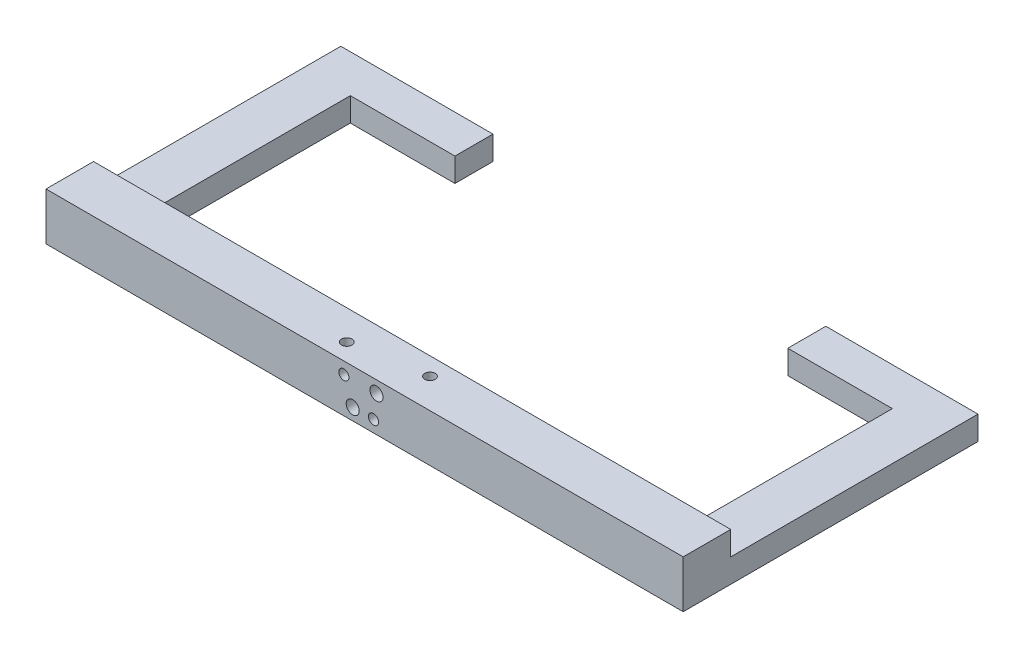
ISO-10303-21;
HEADER;
FILE_DESCRIPTION(('STEP AP214'),'2;1');
FILE_NAME('part.step','',(''),(''),'','','');
FILE_SCHEMA(('AUTOMOTIVE_DESIGN { 1 0 10303 214 1 1 1 1 }'));
ENDSEC;
DATA;
#1=APPLICATION_CONTEXT('core data for automotive mechanical design processes');
#2=APPLICATION_PROTOCOL_DEFINITION('international standard','automotive_design',2000,#1);
#3=PRODUCT_CONTEXT('',#1,'mechanical');
#4=PRODUCT('Part','Part','',(#3));
#5=PRODUCT_RELATED_PRODUCT_CATEGORY('part','',(#4));
#6=PRODUCT_DEFINITION_FORMATION('','',#4);
#7=PRODUCT_DEFINITION_CONTEXT('part definition',#1,'design');
#8=PRODUCT_DEFINITION('design','',#6,#7);
#9=PRODUCT_DEFINITION_SHAPE('','',#8);
#10=(LENGTH_UNIT() NAMED_UNIT(*) SI_UNIT(.MILLI.,.METRE.));
#11=(NAMED_UNIT(*) PLANE_ANGLE_UNIT() SI_UNIT($,.RADIAN.));
#12=(NAMED_UNIT(*) SI_UNIT($,.STERADIAN.) SOLID_ANGLE_UNIT());
#13=UNCERTAINTY_MEASURE_WITH_UNIT(LENGTH_MEASURE(1.E-05),#10,'distance_accuracy_value','');
#14=(GEOMETRIC_REPRESENTATION_CONTEXT(3) GLOBAL_UNCERTAINTY_ASSIGNED_CONTEXT((#13)) GLOBAL_UNIT_ASSIGNED_CONTEXT((#10,
#11,#12)) REPRESENTATION_CONTEXT('',''));
#15=CARTESIAN_POINT('',(0.,0.,0.));
#16=DIRECTION('',(0.,0.,1.));
#17=DIRECTION('',(1.,0.,0.));
#18=AXIS2_PLACEMENT_3D('',#15,#16,#17);
#19=CARTESIAN_POINT('',(0.,12.7,-12.7));
#20=DIRECTION('',(0.,0.,-1.));
#21=DIRECTION('',(-1.,0.,0.));
#22=AXIS2_PLACEMENT_3D('',#19,#20,#21);
#23=PLANE('',#22);
#24=CARTESIAN_POINT('',(88.265,9.525,-12.7));
#25=DIRECTION('',(0.,0.,-1.));
#26=DIRECTION('',(-1.,0.,0.));
#27=AXIS2_PLACEMENT_3D('',#24,#25,#26);
#28=CIRCLE('',#27,1.75);
#29=CARTESIAN_POINT('',(86.515,9.525,-12.7));
#30=VERTEX_POINT('',#29);
#31=EDGE_CURVE('E254',#30,#30,#28,.T.);
#32=ORIENTED_EDGE('',*,*,#31,.F.);
#33=EDGE_LOOP('',(#32));
#34=FACE_BOUND('',#33,.T.);
#35=CARTESIAN_POINT('',(81.915,3.175,-12.7));
#36=DIRECTION('',(0.,0.,-1.));
#37=DIRECTION('',(-1.,0.,0.));
#38=AXIS2_PLACEMENT_3D('',#35,#36,#37);
#39=CIRCLE('',#38,1.75);
#40=CARTESIAN_POINT('',(80.165,3.175,-12.7));
#41=VERTEX_POINT('',#40);
#42=EDGE_CURVE('E260',#41,#41,#39,.T.);
#43=ORIENTED_EDGE('',*,*,#42,.F.);
#44=EDGE_LOOP('',(#43));
#45=FACE_BOUND('',#44,.T.);
#46=CARTESIAN_POINT('',(87.4776,3.175,-12.7));
#47=DIRECTION('',(0.,0.,-1.));
#48=DIRECTION('',(-1.,0.,0.));
#49=AXIS2_PLACEMENT_3D('',#46,#47,#48);
#50=CIRCLE('',#49,1.35255);
#51=CARTESIAN_POINT('',(86.12505,3.175,-12.7));
#52=VERTEX_POINT('',#51);
#53=EDGE_CURVE('E267',#52,#52,#50,.T.);
#54=ORIENTED_EDGE('',*,*,#53,.F.);
#55=EDGE_LOOP('',(#54));
#56=FACE_BOUND('',#55,.T.);
#57=CARTESIAN_POINT('',(79.5464525420341,9.525,-12.7));
#58=DIRECTION('',(0.,0.,-1.));
#59=DIRECTION('',(-1.,0.,0.));
#60=AXIS2_PLACEMENT_3D('',#57,#58,#59);
#61=CIRCLE('',#60,1.35255);
#62=CARTESIAN_POINT('',(78.1939025420341,9.525,-12.7));
#63=VERTEX_POINT('',#62);
#64=EDGE_CURVE('E271',#63,#63,#61,.T.);
#65=ORIENTED_EDGE('',*,*,#64,.F.);
#66=EDGE_LOOP('',(#65));
#67=FACE_BOUND('',#66,.T.);
#68=DIRECTION('',(1.,0.,0.));
#69=VECTOR('',#68,1.);
#70=CARTESIAN_POINT('',(0.,6.35,-12.7));
#71=LINE('',#70,#69);
#72=CARTESIAN_POINT('',(157.48,6.35,-12.7));
#73=VERTEX_POINT('',#72);
#74=CARTESIAN_POINT('',(170.18,6.35,-12.7));
#75=VERTEX_POINT('',#74);
#76=EDGE_CURVE('E58',#73,#75,#71,.T.);
#77=ORIENTED_EDGE('',*,*,#76,.F.);
#78=DIRECTION('',(0.,-1.,0.));
#79=VECTOR('',#78,1.);
#80=CARTESIAN_POINT('',(157.48,6.35,-12.7));
#81=LINE('',#80,#79);
#82=CARTESIAN_POINT('',(157.48,0.,-12.7));
#83=VERTEX_POINT('',#82);
#84=EDGE_CURVE('E63',#73,#83,#81,.T.);
#85=ORIENTED_EDGE('',*,*,#84,.T.);
#86=DIRECTION('',(1.,0.,0.));
#87=VECTOR('',#86,1.);
#88=CARTESIAN_POINT('',(0.,0.,-12.7));
#89=LINE('',#88,#87);
#90=CARTESIAN_POINT('',(12.7,0.,-12.7));
#91=VERTEX_POINT('',#90);
#92=EDGE_CURVE('E190',#91,#83,#89,.T.);
#93=ORIENTED_EDGE('',*,*,#92,.F.);
#94=DIRECTION('',(0.,-1.,0.));
#95=VECTOR('',#94,1.);
#96=CARTESIAN_POINT('',(12.7,6.35,-12.7));
#97=LINE('',#96,#95);
#98=CARTESIAN_POINT('',(12.7,6.35,-12.7));
#99=VERTEX_POINT('',#98);
#100=EDGE_CURVE('E11',#99,#91,#97,.T.);
#101=ORIENTED_EDGE('',*,*,#100,.F.);
#102=DIRECTION('',(-1.,0.,0.));
#103=VECTOR('',#102,1.);
#104=CARTESIAN_POINT('',(0.,6.35,-12.7));
#105=LINE('',#104,#103);
#106=CARTESIAN_POINT('',(0.,6.35,-12.7));
#107=VERTEX_POINT('',#106);
#108=EDGE_CURVE('E217',#99,#107,#105,.T.);
#109=ORIENTED_EDGE('',*,*,#108,.T.);
#110=DIRECTION('',(0.,-1.,0.));
#111=VECTOR('',#110,1.);
#112=CARTESIAN_POINT('',(0.,12.7,-12.7));
#113=LINE('',#112,#111);
#114=CARTESIAN_POINT('',(0.,12.7,-12.7));
#115=VERTEX_POINT('',#114);
#116=EDGE_CURVE('E213',#115,#107,#113,.T.);
#117=ORIENTED_EDGE('',*,*,#116,.F.);
#118=DIRECTION('',(1.,0.,0.));
#119=VECTOR('',#118,1.);
#120=CARTESIAN_POINT('',(0.,12.7,-12.7));
#121=LINE('',#120,#119);
#122=CARTESIAN_POINT('',(170.18,12.7,-12.7));
#123=VERTEX_POINT('',#122);
#124=EDGE_CURVE('E191',#115,#123,#121,.T.);
#125=ORIENTED_EDGE('',*,*,#124,.T.);
#126=DIRECTION('',(0.,-1.,0.));
#127=VECTOR('',#126,1.);
#128=CARTESIAN_POINT('',(170.18,12.7,-12.7));
#129=LINE('',#128,#127);
#130=EDGE_CURVE('E201',#123,#75,#129,.T.);
#131=ORIENTED_EDGE('',*,*,#130,.T.);
#132=EDGE_LOOP('',(#77,#85,#93,#101,#109,#117,#125,#131));
#133=FACE_BOUND('',#132,.T.);
#134=ADVANCED_FACE('F41',(#34,#45,#56,#67,#133),#23,.T.);
#135=CARTESIAN_POINT('',(12.7,6.35,0.));
#136=DIRECTION('',(1.,0.,0.));
#137=DIRECTION('',(0.,0.,-1.));
#138=AXIS2_PLACEMENT_3D('',#135,#136,#137);
#139=PLANE('',#138);
#140=DIRECTION('',(0.,0.,1.));
#141=VECTOR('',#140,1.);
#142=CARTESIAN_POINT('',(12.7,0.,0.));
#143=LINE('',#142,#141);
#144=CARTESIAN_POINT('',(12.7,0.,-68.58));
#145=VERTEX_POINT('',#144);
#146=EDGE_CURVE('E216',#145,#91,#143,.T.);
#147=ORIENTED_EDGE('',*,*,#146,.F.);
#148=DIRECTION('',(0.,-1.,0.));
#149=VECTOR('',#148,1.);
#150=CARTESIAN_POINT('',(12.7,6.35,-68.58));
#151=LINE('',#150,#149);
#152=CARTESIAN_POINT('',(12.7,6.35,-68.58));
#153=VERTEX_POINT('',#152);
#154=EDGE_CURVE('E50',#153,#145,#151,.T.);
#155=ORIENTED_EDGE('',*,*,#154,.F.);
#156=DIRECTION('',(0.,0.,1.));
#157=VECTOR('',#156,1.);
#158=CARTESIAN_POINT('',(12.7,6.35,0.));
#159=LINE('',#158,#157);
#160=EDGE_CURVE('E220',#153,#99,#159,.T.);
#161=ORIENTED_EDGE('',*,*,#160,.T.);
#162=ORIENTED_EDGE('',*,*,#100,.T.);
#163=EDGE_LOOP('',(#147,#155,#161,#162));
#164=FACE_BOUND('',#163,.T.);
#165=ADVANCED_FACE('F43',(#164),#139,.T.);
#166=CARTESIAN_POINT('',(0.,6.35,-68.58));
#167=DIRECTION('',(0.,0.,1.));
#168=DIRECTION('',(1.,0.,0.));
#169=AXIS2_PLACEMENT_3D('',#166,#167,#168);
#170=PLANE('',#169);
#171=DIRECTION('',(-1.,0.,0.));
#172=VECTOR('',#171,1.);
#173=CARTESIAN_POINT('',(0.,0.,-68.58));
#174=LINE('',#173,#172);
#175=CARTESIAN_POINT('',(40.64,0.,-68.58));
#176=VERTEX_POINT('',#175);
#177=EDGE_CURVE('E237',#176,#145,#174,.T.);
#178=ORIENTED_EDGE('',*,*,#177,.F.);
#179=DIRECTION('',(0.,-1.,0.));
#180=VECTOR('',#179,1.);
#181=CARTESIAN_POINT('',(40.64,6.35,-68.58));
#182=LINE('',#181,#180);
#183=CARTESIAN_POINT('',(40.64,6.35,-68.58));
#184=VERTEX_POINT('',#183);
#185=EDGE_CURVE('E250',#184,#176,#182,.T.);
#186=ORIENTED_EDGE('',*,*,#185,.F.);
#187=DIRECTION('',(-1.,0.,0.));
#188=VECTOR('',#187,1.);
#189=CARTESIAN_POINT('',(0.,6.35,-68.58));
#190=LINE('',#189,#188);
#191=EDGE_CURVE('E224',#184,#153,#190,.T.);
#192=ORIENTED_EDGE('',*,*,#191,.T.);
#193=ORIENTED_EDGE('',*,*,#154,.T.);
#194=EDGE_LOOP('',(#178,#186,#192,#193));
#195=FACE_BOUND('',#194,.T.);
#196=ADVANCED_FACE('F307',(#195),#170,.T.);
#197=CARTESIAN_POINT('',(40.64,6.35,0.));
#198=DIRECTION('',(-1.,0.,0.));
#199=DIRECTION('',(0.,0.,1.));
#200=AXIS2_PLACEMENT_3D('',#197,#198,#199);
#201=PLANE('',#200);
#202=DIRECTION('',(0.,0.,-1.));
#203=VECTOR('',#202,1.);
#204=CARTESIAN_POINT('',(40.64,0.,0.));
#205=LINE('',#204,#203);
#206=CARTESIAN_POINT('',(40.64,0.,-78.74));
#207=VERTEX_POINT('',#206);
#208=EDGE_CURVE('E240',#176,#207,#205,.T.);
#209=ORIENTED_EDGE('',*,*,#208,.T.);
#210=DIRECTION('',(0.,-1.,0.));
#211=VECTOR('',#210,1.);
#212=CARTESIAN_POINT('',(40.64,6.35,-78.74));
#213=LINE('',#212,#211);
#214=CARTESIAN_POINT('',(40.64,6.35,-78.74));
#215=VERTEX_POINT('',#214);
#216=EDGE_CURVE('E248',#215,#207,#213,.T.);
#217=ORIENTED_EDGE('',*,*,#216,.F.);
#218=DIRECTION('',(0.,0.,-1.));
#219=VECTOR('',#218,1.);
#220=CARTESIAN_POINT('',(40.64,6.35,0.));
#221=LINE('',#220,#219);
#222=EDGE_CURVE('E227',#184,#215,#221,.T.);
#223=ORIENTED_EDGE('',*,*,#222,.F.);
#224=ORIENTED_EDGE('',*,*,#185,.T.);
#225=EDGE_LOOP('',(#209,#217,#223,#224));
#226=FACE_BOUND('',#225,.T.);
#227=ADVANCED_FACE('F312',(#226),#201,.F.);
#228=CARTESIAN_POINT('',(0.,6.35,-78.74));
#229=DIRECTION('',(0.,0.,-1.));
#230=DIRECTION('',(-1.,0.,0.));
#231=AXIS2_PLACEMENT_3D('',#228,#229,#230);
#232=PLANE('',#231);
#233=DIRECTION('',(1.,0.,0.));
#234=VECTOR('',#233,1.);
#235=CARTESIAN_POINT('',(0.,0.,-78.74));
#236=LINE('',#235,#234);
#237=CARTESIAN_POINT('',(0.,0.,-78.74));
#238=VERTEX_POINT('',#237);
#239=EDGE_CURVE('E243',#238,#207,#236,.T.);
#240=ORIENTED_EDGE('',*,*,#239,.F.);
#241=DIRECTION('',(0.,-1.,0.));
#242=VECTOR('',#241,1.);
#243=CARTESIAN_POINT('',(0.,6.35,-78.74));
#244=LINE('',#243,#242);
#245=CARTESIAN_POINT('',(0.,6.35,-78.74));
#246=VERTEX_POINT('',#245);
#247=EDGE_CURVE('E234',#246,#238,#244,.T.);
#248=ORIENTED_EDGE('',*,*,#247,.F.);
#249=DIRECTION('',(1.,0.,0.));
#250=VECTOR('',#249,1.);
#251=CARTESIAN_POINT('',(0.,6.35,-78.74));
#252=LINE('',#251,#250);
#253=EDGE_CURVE('E229',#246,#215,#252,.T.);
#254=ORIENTED_EDGE('',*,*,#253,.T.);
#255=ORIENTED_EDGE('',*,*,#216,.T.);
#256=EDGE_LOOP('',(#240,#248,#254,#255));
#257=FACE_BOUND('',#256,.T.);
#258=ADVANCED_FACE('F317',(#257),#232,.T.);
#259=CARTESIAN_POINT('',(0.,6.35,0.));
#260=DIRECTION('',(1.,0.,0.));
#261=DIRECTION('',(0.,0.,-1.));
#262=AXIS2_PLACEMENT_3D('',#259,#260,#261);
#263=PLANE('',#262);
#264=DIRECTION('',(0.,0.,1.));
#265=VECTOR('',#264,1.);
#266=CARTESIAN_POINT('',(0.,0.,0.));
#267=LINE('',#266,#265);
#268=CARTESIAN_POINT('',(0.,0.,0.));
#269=VERTEX_POINT('',#268);
#270=EDGE_CURVE('E221',#238,#269,#267,.T.);
#271=ORIENTED_EDGE('',*,*,#270,.T.);
#272=DIRECTION('',(0.,-1.,0.));
#273=VECTOR('',#272,1.);
#274=CARTESIAN_POINT('',(0.,12.7,0.));
#275=LINE('',#274,#273);
#276=CARTESIAN_POINT('',(0.,12.7,0.));
#277=VERTEX_POINT('',#276);
#278=EDGE_CURVE('E210',#277,#269,#275,.T.);
#279=ORIENTED_EDGE('',*,*,#278,.F.);
#280=DIRECTION('',(0.,0.,1.));
#281=VECTOR('',#280,1.);
#282=CARTESIAN_POINT('',(0.,12.7,0.));
#283=LINE('',#282,#281);
#284=EDGE_CURVE('E194',#115,#277,#283,.T.);
#285=ORIENTED_EDGE('',*,*,#284,.F.);
#286=ORIENTED_EDGE('',*,*,#116,.T.);
#287=DIRECTION('',(0.,0.,1.));
#288=VECTOR('',#287,1.);
#289=CARTESIAN_POINT('',(0.,6.35,0.));
#290=LINE('',#289,#288);
#291=EDGE_CURVE('E232',#246,#107,#290,.T.);
#292=ORIENTED_EDGE('',*,*,#291,.F.);
#293=ORIENTED_EDGE('',*,*,#247,.T.);
#294=EDGE_LOOP('',(#271,#279,#285,#286,#292,#293));
#295=FACE_BOUND('',#294,.T.);
#296=ADVANCED_FACE('F320',(#295),#263,.F.);
#297=CARTESIAN_POINT('',(0.,6.35,0.));
#298=DIRECTION('',(0.,1.,0.));
#299=DIRECTION('',(0.,0.,1.));
#300=AXIS2_PLACEMENT_3D('',#297,#298,#299);
#301=PLANE('',#300);
#302=ORIENTED_EDGE('',*,*,#108,.F.);
#303=ORIENTED_EDGE('',*,*,#160,.F.);
#304=ORIENTED_EDGE('',*,*,#191,.F.);
#305=ORIENTED_EDGE('',*,*,#222,.T.);
#306=ORIENTED_EDGE('',*,*,#253,.F.);
#307=ORIENTED_EDGE('',*,*,#291,.T.);
#308=EDGE_LOOP('',(#302,#303,#304,#305,#306,#307));
#309=FACE_BOUND('',#308,.T.);
#310=ADVANCED_FACE('F304',(#309),#301,.T.);
#311=CARTESIAN_POINT('',(0.,0.,0.));
#312=DIRECTION('',(0.,1.,0.));
#313=DIRECTION('',(0.,0.,1.));
#314=AXIS2_PLACEMENT_3D('',#311,#312,#313);
#315=PLANE('',#314);
#316=CARTESIAN_POINT('',(75.565,0.,-4.76250000000002));
#317=DIRECTION('',(0.,1.,0.));
#318=DIRECTION('',(0.,0.,1.));
#319=AXIS2_PLACEMENT_3D('',#316,#317,#318);
#320=CIRCLE('',#319,1.39699999999999);
#321=CARTESIAN_POINT('',(75.565,0.,-3.36550000000003));
#322=VERTEX_POINT('',#321);
#323=EDGE_CURVE('E177',#322,#322,#320,.F.);
#324=ORIENTED_EDGE('',*,*,#323,.F.);
#325=EDGE_LOOP('',(#324));
#326=FACE_BOUND('',#325,.T.);
#327=CARTESIAN_POINT('',(94.615,0.,-7.93750000000002));
#328=DIRECTION('',(0.,1.,0.));
#329=DIRECTION('',(0.,0.,1.));
#330=AXIS2_PLACEMENT_3D('',#327,#328,#329);
#331=CIRCLE('',#330,1.39699999999999);
#332=CARTESIAN_POINT('',(94.615,0.,-6.54050000000003));
#333=VERTEX_POINT('',#332);
#334=EDGE_CURVE('E274',#333,#333,#331,.F.);
#335=ORIENTED_EDGE('',*,*,#334,.F.);
#336=EDGE_LOOP('',(#335));
#337=FACE_BOUND('',#336,.T.);
#338=ORIENTED_EDGE('',*,*,#146,.T.);
#339=ORIENTED_EDGE('',*,*,#92,.T.);
#340=DIRECTION('',(0.,0.,1.));
#341=VECTOR('',#340,1.);
#342=CARTESIAN_POINT('',(157.48,0.,0.));
#343=LINE('',#342,#341);
#344=CARTESIAN_POINT('',(157.48,0.,-68.58));
#345=VERTEX_POINT('',#344);
#346=EDGE_CURVE('E173',#345,#83,#343,.T.);
#347=ORIENTED_EDGE('',*,*,#346,.F.);
#348=DIRECTION('',(1.,0.,0.));
#349=VECTOR('',#348,1.);
#350=CARTESIAN_POINT('',(0.,0.,-68.58));
#351=LINE('',#350,#349);
#352=CARTESIAN_POINT('',(129.54,0.,-68.58));
#353=VERTEX_POINT('',#352);
#354=EDGE_CURVE('E182',#353,#345,#351,.T.);
#355=ORIENTED_EDGE('',*,*,#354,.F.);
#356=DIRECTION('',(0.,0.,-1.));
#357=VECTOR('',#356,1.);
#358=CARTESIAN_POINT('',(129.54,0.,0.));
#359=LINE('',#358,#357);
#360=CARTESIAN_POINT('',(129.54,0.,-78.74));
#361=VERTEX_POINT('',#360);
#362=EDGE_CURVE('E179',#353,#361,#359,.T.);
#363=ORIENTED_EDGE('',*,*,#362,.T.);
#364=DIRECTION('',(-1.,0.,0.));
#365=VECTOR('',#364,1.);
#366=CARTESIAN_POINT('',(0.,0.,-78.74));
#367=LINE('',#366,#365);
#368=CARTESIAN_POINT('',(170.18,0.,-78.74));
#369=VERTEX_POINT('',#368);
#370=EDGE_CURVE('E176',#369,#361,#367,.T.);
#371=ORIENTED_EDGE('',*,*,#370,.F.);
#372=DIRECTION('',(0.,0.,1.));
#373=VECTOR('',#372,1.);
#374=CARTESIAN_POINT('',(170.18,0.,0.));
#375=LINE('',#374,#373);
#376=CARTESIAN_POINT('',(170.18,0.,0.));
#377=VERTEX_POINT('',#376);
#378=EDGE_CURVE('E149',#369,#377,#375,.T.);
#379=ORIENTED_EDGE('',*,*,#378,.T.);
#380=DIRECTION('',(1.,0.,0.));
#381=VECTOR('',#380,1.);
#382=CARTESIAN_POINT('',(0.,0.,0.));
#383=LINE('',#382,#381);
#384=EDGE_CURVE('E203',#269,#377,#383,.T.);
#385=ORIENTED_EDGE('',*,*,#384,.F.);
#386=ORIENTED_EDGE('',*,*,#270,.F.);
#387=ORIENTED_EDGE('',*,*,#239,.T.);
#388=ORIENTED_EDGE('',*,*,#208,.F.);
#389=ORIENTED_EDGE('',*,*,#177,.T.);
#390=EDGE_LOOP('',(#338,#339,#347,#355,#363,#371,#379,#385,#386,#387,#388,#389));
#391=FACE_BOUND('',#390,.T.);
#392=ADVANCED_FACE('F296',(#326,#337,#391),#315,.F.);
#393=CARTESIAN_POINT('',(0.,12.7,0.));
#394=DIRECTION('',(0.,0.,-1.));
#395=DIRECTION('',(-1.,0.,0.));
#396=AXIS2_PLACEMENT_3D('',#393,#394,#395);
#397=PLANE('',#396);
#398=CARTESIAN_POINT('',(88.265,9.525,0.));
#399=DIRECTION('',(0.,0.,-1.));
#400=DIRECTION('',(-1.,0.,0.));
#401=AXIS2_PLACEMENT_3D('',#398,#399,#400);
#402=CIRCLE('',#401,1.75);
#403=CARTESIAN_POINT('',(86.515,9.525,0.));
#404=VERTEX_POINT('',#403);
#405=EDGE_CURVE('E45',#404,#404,#402,.T.);
#406=ORIENTED_EDGE('',*,*,#405,.T.);
#407=EDGE_LOOP('',(#406));
#408=FACE_BOUND('',#407,.T.);
#409=CARTESIAN_POINT('',(81.915,3.175,0.));
#410=DIRECTION('',(0.,0.,-1.));
#411=DIRECTION('',(-1.,0.,0.));
#412=AXIS2_PLACEMENT_3D('',#409,#410,#411);
#413=CIRCLE('',#412,1.75);
#414=CARTESIAN_POINT('',(80.165,3.175,0.));
#415=VERTEX_POINT('',#414);
#416=EDGE_CURVE('E252',#415,#415,#413,.T.);
#417=ORIENTED_EDGE('',*,*,#416,.T.);
#418=EDGE_LOOP('',(#417));
#419=FACE_BOUND('',#418,.T.);
#420=CARTESIAN_POINT('',(87.4776,3.175,0.));
#421=DIRECTION('',(0.,0.,-1.));
#422=DIRECTION('',(-1.,0.,0.));
#423=AXIS2_PLACEMENT_3D('',#420,#421,#422);
#424=CIRCLE('',#423,1.35255);
#425=CARTESIAN_POINT('',(86.12505,3.175,0.));
#426=VERTEX_POINT('',#425);
#427=EDGE_CURVE('E270',#426,#426,#424,.F.);
#428=ORIENTED_EDGE('',*,*,#427,.F.);
#429=EDGE_LOOP('',(#428));
#430=FACE_BOUND('',#429,.T.);
#431=CARTESIAN_POINT('',(79.5464525420341,9.525,0.));
#432=DIRECTION('',(0.,0.,-1.));
#433=DIRECTION('',(-1.,0.,0.));
#434=AXIS2_PLACEMENT_3D('',#431,#432,#433);
#435=CIRCLE('',#434,1.35255);
#436=CARTESIAN_POINT('',(78.1939025420341,9.525,0.));
#437=VERTEX_POINT('',#436);
#438=EDGE_CURVE('E258',#437,#437,#435,.F.);
#439=ORIENTED_EDGE('',*,*,#438,.F.);
#440=EDGE_LOOP('',(#439));
#441=FACE_BOUND('',#440,.T.);
#442=ORIENTED_EDGE('',*,*,#384,.T.);
#443=DIRECTION('',(0.,-1.,0.));
#444=VECTOR('',#443,1.);
#445=CARTESIAN_POINT('',(170.18,12.7,0.));
#446=LINE('',#445,#444);
#447=CARTESIAN_POINT('',(170.18,12.7,0.));
#448=VERTEX_POINT('',#447);
#449=EDGE_CURVE('E208',#448,#377,#446,.T.);
#450=ORIENTED_EDGE('',*,*,#449,.F.);
#451=DIRECTION('',(1.,0.,0.));
#452=VECTOR('',#451,1.);
#453=CARTESIAN_POINT('',(0.,12.7,0.));
#454=LINE('',#453,#452);
#455=EDGE_CURVE('E196',#277,#448,#454,.T.);
#456=ORIENTED_EDGE('',*,*,#455,.F.);
#457=ORIENTED_EDGE('',*,*,#278,.T.);
#458=EDGE_LOOP('',(#442,#450,#456,#457));
#459=FACE_BOUND('',#458,.T.);
#460=ADVANCED_FACE('F331',(#408,#419,#430,#441,#459),#397,.F.);
#461=CARTESIAN_POINT('',(170.18,12.7,0.));
#462=DIRECTION('',(1.,0.,0.));
#463=DIRECTION('',(0.,0.,-1.));
#464=AXIS2_PLACEMENT_3D('',#461,#462,#463);
#465=PLANE('',#464);
#466=ORIENTED_EDGE('',*,*,#378,.F.);
#467=DIRECTION('',(0.,-1.,0.));
#468=VECTOR('',#467,1.);
#469=CARTESIAN_POINT('',(170.18,6.35,-78.74));
#470=LINE('',#469,#468);
#471=CARTESIAN_POINT('',(170.18,6.35,-78.74));
#472=VERTEX_POINT('',#471);
#473=EDGE_CURVE('E143',#472,#369,#470,.T.);
#474=ORIENTED_EDGE('',*,*,#473,.F.);
#475=DIRECTION('',(0.,0.,1.));
#476=VECTOR('',#475,1.);
#477=CARTESIAN_POINT('',(170.18,6.35,0.));
#478=LINE('',#477,#476);
#479=EDGE_CURVE('E147',#472,#75,#478,.T.);
#480=ORIENTED_EDGE('',*,*,#479,.T.);
#481=ORIENTED_EDGE('',*,*,#130,.F.);
#482=DIRECTION('',(0.,0.,1.));
#483=VECTOR('',#482,1.);
#484=CARTESIAN_POINT('',(170.18,12.7,0.));
#485=LINE('',#484,#483);
#486=EDGE_CURVE('E198',#123,#448,#485,.T.);
#487=ORIENTED_EDGE('',*,*,#486,.T.);
#488=ORIENTED_EDGE('',*,*,#449,.T.);
#489=EDGE_LOOP('',(#466,#474,#480,#481,#487,#488));
#490=FACE_BOUND('',#489,.T.);
#491=ADVANCED_FACE('F145',(#490),#465,.T.);
#492=CARTESIAN_POINT('',(0.,12.7,0.));
#493=DIRECTION('',(0.,1.,0.));
#494=DIRECTION('',(0.,0.,1.));
#495=AXIS2_PLACEMENT_3D('',#492,#493,#494);
#496=PLANE('',#495);
#497=CARTESIAN_POINT('',(75.565,12.7,-4.76250000000002));
#498=DIRECTION('',(0.,1.,0.));
#499=DIRECTION('',(0.,0.,-1.));
#500=AXIS2_PLACEMENT_3D('',#497,#498,#499);
#501=CIRCLE('',#500,1.39699999999999);
#502=CARTESIAN_POINT('',(75.565,12.7,-6.15950000000001));
#503=VERTEX_POINT('',#502);
#504=EDGE_CURVE('E279',#503,#503,#501,.T.);
#505=ORIENTED_EDGE('',*,*,#504,.F.);
#506=EDGE_LOOP('',(#505));
#507=FACE_BOUND('',#506,.T.);
#508=CARTESIAN_POINT('',(94.615,12.7,-7.93750000000002));
#509=DIRECTION('',(0.,1.,0.));
#510=DIRECTION('',(0.,0.,-1.));
#511=AXIS2_PLACEMENT_3D('',#508,#509,#510);
#512=CIRCLE('',#511,1.39699999999999);
#513=CARTESIAN_POINT('',(94.615,12.7,-9.33450000000001));
#514=VERTEX_POINT('',#513);
#515=EDGE_CURVE('E282',#514,#514,#512,.T.);
#516=ORIENTED_EDGE('',*,*,#515,.F.);
#517=EDGE_LOOP('',(#516));
#518=FACE_BOUND('',#517,.T.);
#519=ORIENTED_EDGE('',*,*,#124,.F.);
#520=ORIENTED_EDGE('',*,*,#284,.T.);
#521=ORIENTED_EDGE('',*,*,#455,.T.);
#522=ORIENTED_EDGE('',*,*,#486,.F.);
#523=EDGE_LOOP('',(#519,#520,#521,#522));
#524=FACE_BOUND('',#523,.T.);
#525=ADVANCED_FACE('F326',(#507,#518,#524),#496,.T.);
#526=CARTESIAN_POINT('',(157.48,6.35,0.));
#527=DIRECTION('',(1.,0.,0.));
#528=DIRECTION('',(0.,0.,-1.));
#529=AXIS2_PLACEMENT_3D('',#526,#527,#528);
#530=PLANE('',#529);
#531=ORIENTED_EDGE('',*,*,#346,.T.);
#532=ORIENTED_EDGE('',*,*,#84,.F.);
#533=DIRECTION('',(0.,0.,1.));
#534=VECTOR('',#533,1.);
#535=CARTESIAN_POINT('',(157.48,6.35,0.));
#536=LINE('',#535,#534);
#537=CARTESIAN_POINT('',(157.48,6.35,-68.58));
#538=VERTEX_POINT('',#537);
#539=EDGE_CURVE('E165',#538,#73,#536,.T.);
#540=ORIENTED_EDGE('',*,*,#539,.F.);
#541=DIRECTION('',(0.,-1.,0.));
#542=VECTOR('',#541,1.);
#543=CARTESIAN_POINT('',(157.48,6.35,-68.58));
#544=LINE('',#543,#542);
#545=EDGE_CURVE('E172',#538,#345,#544,.T.);
#546=ORIENTED_EDGE('',*,*,#545,.T.);
#547=EDGE_LOOP('',(#531,#532,#540,#546));
#548=FACE_BOUND('',#547,.T.);
#549=ADVANCED_FACE('F292',(#548),#530,.F.);
#550=CARTESIAN_POINT('',(0.,6.35,-78.74));
#551=DIRECTION('',(0.,0.,1.));
#552=DIRECTION('',(1.,0.,0.));
#553=AXIS2_PLACEMENT_3D('',#550,#551,#552);
#554=PLANE('',#553);
#555=ORIENTED_EDGE('',*,*,#370,.T.);
#556=DIRECTION('',(0.,-1.,0.));
#557=VECTOR('',#556,1.);
#558=CARTESIAN_POINT('',(129.54,6.35,-78.74));
#559=LINE('',#558,#557);
#560=CARTESIAN_POINT('',(129.54,6.35,-78.74));
#561=VERTEX_POINT('',#560);
#562=EDGE_CURVE('E153',#561,#361,#559,.T.);
#563=ORIENTED_EDGE('',*,*,#562,.F.);
#564=DIRECTION('',(-1.,0.,0.));
#565=VECTOR('',#564,1.);
#566=CARTESIAN_POINT('',(0.,6.35,-78.74));
#567=LINE('',#566,#565);
#568=EDGE_CURVE('E156',#472,#561,#567,.T.);
#569=ORIENTED_EDGE('',*,*,#568,.F.);
#570=ORIENTED_EDGE('',*,*,#473,.T.);
#571=EDGE_LOOP('',(#555,#563,#569,#570));
#572=FACE_BOUND('',#571,.T.);
#573=ADVANCED_FACE('F157',(#572),#554,.F.);
#574=CARTESIAN_POINT('',(129.54,6.35,0.));
#575=DIRECTION('',(-1.,0.,0.));
#576=DIRECTION('',(0.,0.,1.));
#577=AXIS2_PLACEMENT_3D('',#574,#575,#576);
#578=PLANE('',#577);
#579=ORIENTED_EDGE('',*,*,#362,.F.);
#580=DIRECTION('',(0.,-1.,0.));
#581=VECTOR('',#580,1.);
#582=CARTESIAN_POINT('',(129.54,6.35,-68.58));
#583=LINE('',#582,#581);
#584=CARTESIAN_POINT('',(129.54,6.35,-68.58));
#585=VERTEX_POINT('',#584);
#586=EDGE_CURVE('E186',#585,#353,#583,.T.);
#587=ORIENTED_EDGE('',*,*,#586,.F.);
#588=DIRECTION('',(0.,0.,-1.));
#589=VECTOR('',#588,1.);
#590=CARTESIAN_POINT('',(129.54,6.35,0.));
#591=LINE('',#590,#589);
#592=EDGE_CURVE('E161',#585,#561,#591,.T.);
#593=ORIENTED_EDGE('',*,*,#592,.T.);
#594=ORIENTED_EDGE('',*,*,#562,.T.);
#595=EDGE_LOOP('',(#579,#587,#593,#594));
#596=FACE_BOUND('',#595,.T.);
#597=ADVANCED_FACE('F333',(#596),#578,.T.);
#598=CARTESIAN_POINT('',(0.,6.35,-68.58));
#599=DIRECTION('',(0.,0.,-1.));
#600=DIRECTION('',(-1.,0.,0.));
#601=AXIS2_PLACEMENT_3D('',#598,#599,#600);
#602=PLANE('',#601);
#603=ORIENTED_EDGE('',*,*,#354,.T.);
#604=ORIENTED_EDGE('',*,*,#545,.F.);
#605=DIRECTION('',(1.,0.,0.));
#606=VECTOR('',#605,1.);
#607=CARTESIAN_POINT('',(0.,6.35,-68.58));
#608=LINE('',#607,#606);
#609=EDGE_CURVE('E170',#585,#538,#608,.T.);
#610=ORIENTED_EDGE('',*,*,#609,.F.);
#611=ORIENTED_EDGE('',*,*,#586,.T.);
#612=EDGE_LOOP('',(#603,#604,#610,#611));
#613=FACE_BOUND('',#612,.T.);
#614=ADVANCED_FACE('F335',(#613),#602,.F.);
#615=CARTESIAN_POINT('',(0.,6.35,0.));
#616=DIRECTION('',(0.,1.,0.));
#617=DIRECTION('',(0.,0.,1.));
#618=AXIS2_PLACEMENT_3D('',#615,#616,#617);
#619=PLANE('',#618);
#620=ORIENTED_EDGE('',*,*,#539,.T.);
#621=ORIENTED_EDGE('',*,*,#76,.T.);
#622=ORIENTED_EDGE('',*,*,#479,.F.);
#623=ORIENTED_EDGE('',*,*,#568,.T.);
#624=ORIENTED_EDGE('',*,*,#592,.F.);
#625=ORIENTED_EDGE('',*,*,#609,.T.);
#626=EDGE_LOOP('',(#620,#621,#622,#623,#624,#625));
#627=FACE_BOUND('',#626,.T.);
#628=ADVANCED_FACE('F163',(#627),#619,.T.);
#629=CARTESIAN_POINT('',(94.615,-0.000999999999999265,-7.93750000000002));
#630=DIRECTION('',(0.,1.,0.));
#631=DIRECTION('',(0.,0.,1.));
#632=AXIS2_PLACEMENT_3D('',#629,#630,#631);
#633=CYLINDRICAL_SURFACE('',#632,1.39699999999999);
#634=ORIENTED_EDGE('',*,*,#515,.T.);
#635=EDGE_LOOP('',(#634));
#636=FACE_BOUND('',#635,.T.);
#637=ORIENTED_EDGE('',*,*,#334,.T.);
#638=EDGE_LOOP('',(#637));
#639=FACE_BOUND('',#638,.T.);
#640=ADVANCED_FACE('F342',(#636,#639),#633,.F.);
#641=CARTESIAN_POINT('',(75.565,-0.000999999999999265,-4.76250000000002));
#642=DIRECTION('',(0.,1.,0.));
#643=DIRECTION('',(0.,0.,1.));
#644=AXIS2_PLACEMENT_3D('',#641,#642,#643);
#645=CYLINDRICAL_SURFACE('',#644,1.39699999999999);
#646=ORIENTED_EDGE('',*,*,#504,.T.);
#647=EDGE_LOOP('',(#646));
#648=FACE_BOUND('',#647,.T.);
#649=ORIENTED_EDGE('',*,*,#323,.T.);
#650=EDGE_LOOP('',(#649));
#651=FACE_BOUND('',#650,.T.);
#652=ADVANCED_FACE('F465',(#648,#651),#645,.F.);
#653=CARTESIAN_POINT('',(79.5464525420341,9.525,0.00100000000000967));
#654=DIRECTION('',(0.,0.,-1.));
#655=DIRECTION('',(-1.,0.,0.));
#656=AXIS2_PLACEMENT_3D('',#653,#654,#655);
#657=CYLINDRICAL_SURFACE('',#656,1.35255);
#658=ORIENTED_EDGE('',*,*,#64,.T.);
#659=EDGE_LOOP('',(#658));
#660=FACE_BOUND('',#659,.T.);
#661=ORIENTED_EDGE('',*,*,#438,.T.);
#662=EDGE_LOOP('',(#661));
#663=FACE_BOUND('',#662,.T.);
#664=ADVANCED_FACE('F474',(#660,#663),#657,.F.);
#665=CARTESIAN_POINT('',(87.4776,3.175,0.00100000000001141));
#666=DIRECTION('',(0.,0.,-1.));
#667=DIRECTION('',(-1.,0.,0.));
#668=AXIS2_PLACEMENT_3D('',#665,#666,#667);
#669=CYLINDRICAL_SURFACE('',#668,1.35255);
#670=ORIENTED_EDGE('',*,*,#53,.T.);
#671=EDGE_LOOP('',(#670));
#672=FACE_BOUND('',#671,.T.);
#673=ORIENTED_EDGE('',*,*,#427,.T.);
#674=EDGE_LOOP('',(#673));
#675=FACE_BOUND('',#674,.T.);
#676=ADVANCED_FACE('F483',(#672,#675),#669,.F.);
#677=CARTESIAN_POINT('',(81.915,3.175,11.3));
#678=DIRECTION('',(0.,0.,-1.));
#679=DIRECTION('',(-1.,0.,0.));
#680=AXIS2_PLACEMENT_3D('',#677,#678,#679);
#681=CYLINDRICAL_SURFACE('',#680,1.75);
#682=ORIENTED_EDGE('',*,*,#42,.T.);
#683=EDGE_LOOP('',(#682));
#684=FACE_BOUND('',#683,.T.);
#685=ORIENTED_EDGE('',*,*,#416,.F.);
#686=EDGE_LOOP('',(#685));
#687=FACE_BOUND('',#686,.T.);
#688=ADVANCED_FACE('F491',(#684,#687),#681,.F.);
#689=CARTESIAN_POINT('',(88.265,9.525,11.3));
#690=DIRECTION('',(0.,0.,-1.));
#691=DIRECTION('',(-1.,0.,0.));
#692=AXIS2_PLACEMENT_3D('',#689,#690,#691);
#693=CYLINDRICAL_SURFACE('',#692,1.75);
#694=ORIENTED_EDGE('',*,*,#31,.T.);
#695=EDGE_LOOP('',(#694));
#696=FACE_BOUND('',#695,.T.);
#697=ORIENTED_EDGE('',*,*,#405,.F.);
#698=EDGE_LOOP('',(#697));
#699=FACE_BOUND('',#698,.T.);
#700=ADVANCED_FACE('F500',(#696,#699),#693,.F.);
#701=CLOSED_SHELL('',(#134,#165,#196,#227,#258,#296,#310,#392,#460,#491,#525,#549,#573,#597,
#614,#628,#640,#652,#664,#676,#688,#700));
#702=MANIFOLD_SOLID_BREP('B2',#701);
#703=ADVANCED_BREP_SHAPE_REPRESENTATION('',(#18,#702),#14);
#704=SHAPE_DEFINITION_REPRESENTATION(#9,#703);
ENDSEC;
END-ISO-10303-21;
